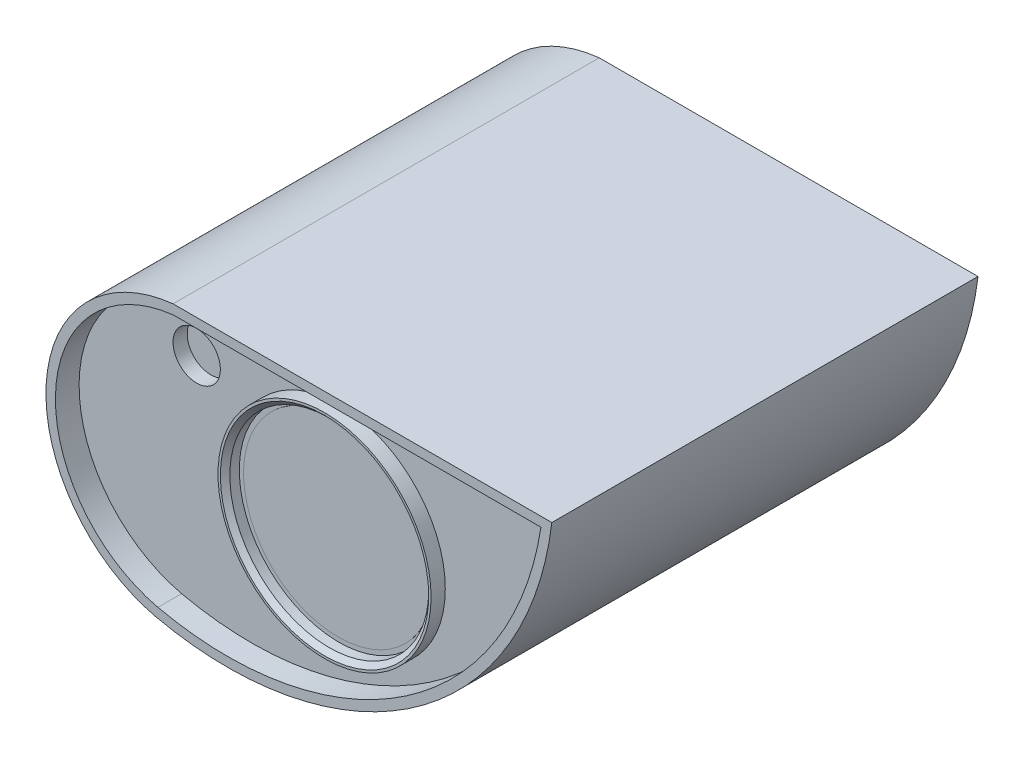
ISO-10303-21;
HEADER;
FILE_DESCRIPTION(('STEP AP214'),'2;1');
FILE_NAME('part.step','',(''),(''),'','','');
FILE_SCHEMA(('AUTOMOTIVE_DESIGN { 1 0 10303 214 1 1 1 1 }'));
ENDSEC;
DATA;
#1=APPLICATION_CONTEXT('core data for automotive mechanical design processes');
#2=APPLICATION_PROTOCOL_DEFINITION('international standard','automotive_design',2000,#1);
#3=PRODUCT_CONTEXT('',#1,'mechanical');
#4=PRODUCT('Part','Part','',(#3));
#5=PRODUCT_RELATED_PRODUCT_CATEGORY('part','',(#4));
#6=PRODUCT_DEFINITION_FORMATION('','',#4);
#7=PRODUCT_DEFINITION_CONTEXT('part definition',#1,'design');
#8=PRODUCT_DEFINITION('design','',#6,#7);
#9=PRODUCT_DEFINITION_SHAPE('','',#8);
#10=(LENGTH_UNIT() NAMED_UNIT(*) SI_UNIT(.MILLI.,.METRE.));
#11=(NAMED_UNIT(*) PLANE_ANGLE_UNIT() SI_UNIT($,.RADIAN.));
#12=(NAMED_UNIT(*) SI_UNIT($,.STERADIAN.) SOLID_ANGLE_UNIT());
#13=UNCERTAINTY_MEASURE_WITH_UNIT(LENGTH_MEASURE(1.E-05),#10,'distance_accuracy_value','');
#14=(GEOMETRIC_REPRESENTATION_CONTEXT(3) GLOBAL_UNCERTAINTY_ASSIGNED_CONTEXT((#13)) GLOBAL_UNIT_ASSIGNED_CONTEXT((#10,
#11,#12)) REPRESENTATION_CONTEXT('',''));
#15=CARTESIAN_POINT('',(0.,0.,0.));
#16=DIRECTION('',(0.,0.,1.));
#17=DIRECTION('',(1.,0.,0.));
#18=AXIS2_PLACEMENT_3D('',#15,#16,#17);
#19=CARTESIAN_POINT('',(30.,-28.3861797156921,85.1));
#20=DIRECTION('',(0.,0.,-1.));
#21=DIRECTION('',(-1.,0.,0.));
#22=AXIS2_PLACEMENT_3D('',#19,#20,#21);
#23=CYLINDRICAL_SURFACE('',#22,20.);
#24=CARTESIAN_POINT('',(30.,-28.3861797156921,85.1));
#25=DIRECTION('',(0.,0.,1.));
#26=DIRECTION('',(1.,0.,0.));
#27=AXIS2_PLACEMENT_3D('',#24,#25,#26);
#28=CIRCLE('',#27,20.);
#29=CARTESIAN_POINT('',(50.,-28.3861797156921,85.1));
#30=VERTEX_POINT('',#29);
#31=EDGE_CURVE('E11',#30,#30,#28,.T.);
#32=ORIENTED_EDGE('',*,*,#31,.F.);
#33=EDGE_LOOP('',(#32));
#34=FACE_BOUND('',#33,.T.);
#35=CARTESIAN_POINT('',(30.,-28.3861797156921,85.));
#36=DIRECTION('',(0.,0.,1.));
#37=DIRECTION('',(1.,0.,0.));
#38=AXIS2_PLACEMENT_3D('',#35,#36,#37);
#39=CIRCLE('',#38,20.);
#40=CARTESIAN_POINT('',(50.,-28.3861797156921,85.));
#41=VERTEX_POINT('',#40);
#42=EDGE_CURVE('E59',#41,#41,#39,.T.);
#43=ORIENTED_EDGE('',*,*,#42,.T.);
#44=EDGE_LOOP('',(#43));
#45=FACE_BOUND('',#44,.T.);
#46=ADVANCED_FACE('F56',(#34,#45),#23,.T.);
#47=CARTESIAN_POINT('',(30.,-28.3861797156921,85.1));
#48=DIRECTION('',(0.,0.,1.));
#49=DIRECTION('',(1.,0.,0.));
#50=AXIS2_PLACEMENT_3D('',#47,#48,#49);
#51=PLANE('',#50);
#52=ORIENTED_EDGE('',*,*,#31,.T.);
#53=EDGE_LOOP('',(#52));
#54=FACE_BOUND('',#53,.T.);
#55=ADVANCED_FACE('F71',(#54),#51,.T.);
#56=CARTESIAN_POINT('',(30.,-28.3861797156921,85.));
#57=DIRECTION('',(0.,0.,1.));
#58=DIRECTION('',(1.,0.,0.));
#59=AXIS2_PLACEMENT_3D('',#56,#57,#58);
#60=PLANE('',#59);
#61=ORIENTED_EDGE('',*,*,#42,.F.);
#62=EDGE_LOOP('',(#61));
#63=FACE_BOUND('',#62,.T.);
#64=ADVANCED_FACE('F69',(#63),#60,.F.);
#65=CLOSED_SHELL('',(#46,#55,#64));
#66=MANIFOLD_SOLID_BREP('B2',#65);
#67=CARTESIAN_POINT('',(0.,0.,85.));
#68=DIRECTION('',(0.,0.,1.));
#69=DIRECTION('',(1.,0.,0.));
#70=AXIS2_PLACEMENT_3D('',#67,#68,#69);
#71=PLANE('',#70);
#72=CARTESIAN_POINT('',(30.,-28.3861797156921,85.));
#73=DIRECTION('',(0.,0.,1.));
#74=DIRECTION('',(1.,0.,0.));
#75=AXIS2_PLACEMENT_3D('',#72,#73,#74);
#76=CIRCLE('',#75,20.);
#77=CARTESIAN_POINT('',(50.,-28.3861797156921,85.));
#78=VERTEX_POINT('',#77);
#79=EDGE_CURVE('E273',#78,#78,#76,.T.);
#80=ORIENTED_EDGE('',*,*,#79,.F.);
#81=EDGE_LOOP('',(#80));
#82=FACE_BOUND('',#81,.T.);
#83=CARTESIAN_POINT('',(30.,-28.3861797156921,85.));
#84=DIRECTION('',(0.,0.,1.));
#85=DIRECTION('',(1.,0.,0.));
#86=AXIS2_PLACEMENT_3D('',#83,#84,#85);
#87=CIRCLE('',#86,21.);
#88=CARTESIAN_POINT('',(51.,-28.3861797156921,85.));
#89=VERTEX_POINT('',#88);
#90=EDGE_CURVE('E216',#89,#89,#87,.F.);
#91=ORIENTED_EDGE('',*,*,#90,.F.);
#92=EDGE_LOOP('',(#91));
#93=FACE_BOUND('',#92,.T.);
#94=ADVANCED_FACE('F106',(#82,#93),#71,.T.);
#95=CARTESIAN_POINT('',(0.,0.,90.));
#96=DIRECTION('',(0.,0.,1.));
#97=DIRECTION('',(1.,0.,0.));
#98=AXIS2_PLACEMENT_3D('',#95,#96,#97);
#99=PLANE('',#98);
#100=CARTESIAN_POINT('',(11.4971292391756,8.26781092707103,90.));
#101=DIRECTION('',(0.,0.,1.));
#102=DIRECTION('',(1.,0.,0.));
#103=AXIS2_PLACEMENT_3D('',#100,#101,#102);
#104=CIRCLE('',#103,69.);
#105=CARTESIAN_POINT('',(80.,0.,90.));
#106=VERTEX_POINT('',#105);
#107=CARTESIAN_POINT('',(-3.63353701608754,-59.0527872481669,90.));
#108=VERTEX_POINT('',#107);
#109=EDGE_CURVE('E199',#106,#108,#104,.F.);
#110=ORIENTED_EDGE('',*,*,#109,.F.);
#111=DIRECTION('',(1.,0.,0.));
#112=VECTOR('',#111,1.);
#113=CARTESIAN_POINT('',(0.,0.,90.));
#114=LINE('',#113,#112);
#115=CARTESIAN_POINT('',(0.0131808239209842,0.,90.));
#116=VERTEX_POINT('',#115);
#117=EDGE_CURVE('E201',#116,#106,#114,.T.);
#118=ORIENTED_EDGE('',*,*,#117,.F.);
#119=CARTESIAN_POINT('',(3.16706713926035,-29.8337560677484,90.));
#120=DIRECTION('',(0.,0.,1.));
#121=DIRECTION('',(1.,0.,0.));
#122=AXIS2_PLACEMENT_3D('',#119,#120,#121);
#123=CIRCLE('',#122,30.);
#124=EDGE_CURVE('E131',#116,#108,#123,.T.);
#125=ORIENTED_EDGE('',*,*,#124,.T.);
#126=EDGE_LOOP('',(#110,#118,#125));
#127=FACE_BOUND('',#126,.T.);
#128=DIRECTION('',(1.,0.,0.));
#129=VECTOR('',#128,1.);
#130=CARTESIAN_POINT('',(0.,-2.,90.));
#131=LINE('',#130,#129);
#132=CARTESIAN_POINT('',(0.1204258474311,-2.,90.));
#133=VERTEX_POINT('',#132);
#134=CARTESIAN_POINT('',(77.7056789798694,-2.,90.));
#135=VERTEX_POINT('',#134);
#136=EDGE_CURVE('E122',#133,#135,#131,.T.);
#137=ORIENTED_EDGE('',*,*,#136,.T.);
#138=CARTESIAN_POINT('',(11.4971292391756,8.26781092707103,90.));
#139=DIRECTION('',(0.,0.,1.));
#140=DIRECTION('',(1.,0.,0.));
#141=AXIS2_PLACEMENT_3D('',#138,#139,#140);
#142=CIRCLE('',#141,67.);
#143=CARTESIAN_POINT('',(-3.18748536572449,-57.1031466451227,90.));
#144=VERTEX_POINT('',#143);
#145=EDGE_CURVE('E174',#135,#144,#142,.F.);
#146=ORIENTED_EDGE('',*,*,#145,.T.);
#147=CARTESIAN_POINT('',(3.16706713926035,-29.8337560677484,90.));
#148=DIRECTION('',(0.,0.,1.));
#149=DIRECTION('',(1.,0.,0.));
#150=AXIS2_PLACEMENT_3D('',#147,#148,#149);
#151=CIRCLE('',#150,28.);
#152=EDGE_CURVE('E197',#133,#144,#151,.T.);
#153=ORIENTED_EDGE('',*,*,#152,.F.);
#154=EDGE_LOOP('',(#137,#146,#153));
#155=FACE_BOUND('',#154,.T.);
#156=ADVANCED_FACE('F238',(#127,#155),#99,.T.);
#157=CARTESIAN_POINT('',(11.4971292391756,8.26781092707103,90.));
#158=DIRECTION('',(0.,0.,-1.));
#159=DIRECTION('',(-1.,0.,0.));
#160=AXIS2_PLACEMENT_3D('',#157,#158,#159);
#161=CYLINDRICAL_SURFACE('',#160,69.);
#162=CARTESIAN_POINT('',(11.4971292391756,8.26781092707103,0.));
#163=DIRECTION('',(0.,0.,1.));
#164=DIRECTION('',(1.,0.,0.));
#165=AXIS2_PLACEMENT_3D('',#162,#163,#164);
#166=CIRCLE('',#165,69.);
#167=CARTESIAN_POINT('',(80.,0.,0.));
#168=VERTEX_POINT('',#167);
#169=CARTESIAN_POINT('',(-3.63353701608754,-59.0527872481669,0.));
#170=VERTEX_POINT('',#169);
#171=EDGE_CURVE('E176',#168,#170,#166,.F.);
#172=ORIENTED_EDGE('',*,*,#171,.F.);
#173=DIRECTION('',(0.,0.,-1.));
#174=VECTOR('',#173,1.);
#175=CARTESIAN_POINT('',(80.,0.,90.));
#176=LINE('',#175,#174);
#177=EDGE_CURVE('E152',#106,#168,#176,.T.);
#178=ORIENTED_EDGE('',*,*,#177,.F.);
#179=ORIENTED_EDGE('',*,*,#109,.T.);
#180=DIRECTION('',(0.,0.,-1.));
#181=VECTOR('',#180,1.);
#182=CARTESIAN_POINT('',(-3.63353701608754,-59.0527872481669,90.));
#183=LINE('',#182,#181);
#184=EDGE_CURVE('E149',#108,#170,#183,.T.);
#185=ORIENTED_EDGE('',*,*,#184,.T.);
#186=EDGE_LOOP('',(#172,#178,#179,#185));
#187=FACE_BOUND('',#186,.T.);
#188=ADVANCED_FACE('F244',(#187),#161,.T.);
#189=CARTESIAN_POINT('',(0.,0.,90.));
#190=DIRECTION('',(0.,1.,0.));
#191=DIRECTION('',(0.,0.,1.));
#192=AXIS2_PLACEMENT_3D('',#189,#190,#191);
#193=PLANE('',#192);
#194=DIRECTION('',(1.,0.,0.));
#195=VECTOR('',#194,1.);
#196=CARTESIAN_POINT('',(0.,0.,0.));
#197=LINE('',#196,#195);
#198=CARTESIAN_POINT('',(0.0131808239209842,0.,0.));
#199=VERTEX_POINT('',#198);
#200=EDGE_CURVE('E208',#199,#168,#197,.T.);
#201=ORIENTED_EDGE('',*,*,#200,.F.);
#202=DIRECTION('',(0.,0.,-1.));
#203=VECTOR('',#202,1.);
#204=CARTESIAN_POINT('',(0.0131808239209842,0.,90.));
#205=LINE('',#204,#203);
#206=EDGE_CURVE('E213',#116,#199,#205,.T.);
#207=ORIENTED_EDGE('',*,*,#206,.F.);
#208=ORIENTED_EDGE('',*,*,#117,.T.);
#209=ORIENTED_EDGE('',*,*,#177,.T.);
#210=EDGE_LOOP('',(#201,#207,#208,#209));
#211=FACE_BOUND('',#210,.T.);
#212=ADVANCED_FACE('F293',(#211),#193,.T.);
#213=CARTESIAN_POINT('',(3.16706713926035,-29.8337560677484,90.));
#214=DIRECTION('',(0.,0.,-1.));
#215=DIRECTION('',(-1.,0.,0.));
#216=AXIS2_PLACEMENT_3D('',#213,#214,#215);
#217=CYLINDRICAL_SURFACE('',#216,30.);
#218=CARTESIAN_POINT('',(3.16706713926035,-29.8337560677484,0.));
#219=DIRECTION('',(0.,0.,1.));
#220=DIRECTION('',(1.,0.,0.));
#221=AXIS2_PLACEMENT_3D('',#218,#219,#220);
#222=CIRCLE('',#221,30.);
#223=EDGE_CURVE('E202',#199,#170,#222,.T.);
#224=ORIENTED_EDGE('',*,*,#223,.T.);
#225=ORIENTED_EDGE('',*,*,#184,.F.);
#226=ORIENTED_EDGE('',*,*,#124,.F.);
#227=ORIENTED_EDGE('',*,*,#206,.T.);
#228=EDGE_LOOP('',(#224,#225,#226,#227));
#229=FACE_BOUND('',#228,.T.);
#230=ADVANCED_FACE('F288',(#229),#217,.T.);
#231=CARTESIAN_POINT('',(0.,0.,0.));
#232=DIRECTION('',(0.,0.,1.));
#233=DIRECTION('',(1.,0.,0.));
#234=AXIS2_PLACEMENT_3D('',#231,#232,#233);
#235=PLANE('',#234);
#236=CARTESIAN_POINT('',(30.,-28.3861797156921,0.));
#237=DIRECTION('',(0.,0.,1.));
#238=DIRECTION('',(1.,0.,0.));
#239=AXIS2_PLACEMENT_3D('',#236,#237,#238);
#240=CIRCLE('',#239,20.);
#241=CARTESIAN_POINT('',(50.,-28.3861797156921,0.));
#242=VERTEX_POINT('',#241);
#243=EDGE_CURVE('E186',#242,#242,#240,.T.);
#244=ORIENTED_EDGE('',*,*,#243,.T.);
#245=EDGE_LOOP('',(#244));
#246=FACE_BOUND('',#245,.T.);
#247=ORIENTED_EDGE('',*,*,#171,.T.);
#248=ORIENTED_EDGE('',*,*,#223,.F.);
#249=ORIENTED_EDGE('',*,*,#200,.T.);
#250=EDGE_LOOP('',(#247,#248,#249));
#251=FACE_BOUND('',#250,.T.);
#252=ADVANCED_FACE('F285',(#246,#251),#235,.F.);
#253=CARTESIAN_POINT('',(11.4971292391756,8.26781092707103,90.));
#254=DIRECTION('',(0.,0.,-1.));
#255=DIRECTION('',(-1.,0.,0.));
#256=AXIS2_PLACEMENT_3D('',#253,#254,#255);
#257=CYLINDRICAL_SURFACE('',#256,67.);
#258=CARTESIAN_POINT('',(11.4971292391756,8.26781092707103,85.));
#259=DIRECTION('',(0.,0.,1.));
#260=DIRECTION('',(1.,0.,0.));
#261=AXIS2_PLACEMENT_3D('',#258,#259,#260);
#262=CIRCLE('',#261,67.);
#263=CARTESIAN_POINT('',(77.7056789798694,-2.,85.));
#264=VERTEX_POINT('',#263);
#265=CARTESIAN_POINT('',(-3.18748536572722,-57.1031466451221,85.));
#266=VERTEX_POINT('',#265);
#267=EDGE_CURVE('E172',#264,#266,#262,.F.);
#268=ORIENTED_EDGE('',*,*,#267,.T.);
#269=DIRECTION('',(0.,0.,-1.));
#270=VECTOR('',#269,1.);
#271=CARTESIAN_POINT('',(-3.18748536572449,-57.1031466451227,90.));
#272=LINE('',#271,#270);
#273=EDGE_CURVE('E193',#144,#266,#272,.T.);
#274=ORIENTED_EDGE('',*,*,#273,.F.);
#275=ORIENTED_EDGE('',*,*,#145,.F.);
#276=DIRECTION('',(0.,0.,-1.));
#277=VECTOR('',#276,1.);
#278=CARTESIAN_POINT('',(77.7056789798694,-2.,90.));
#279=LINE('',#278,#277);
#280=EDGE_CURVE('E168',#135,#264,#279,.T.);
#281=ORIENTED_EDGE('',*,*,#280,.T.);
#282=EDGE_LOOP('',(#268,#274,#275,#281));
#283=FACE_BOUND('',#282,.T.);
#284=ADVANCED_FACE('F170',(#283),#257,.F.);
#285=CARTESIAN_POINT('',(0.,-2.,90.));
#286=DIRECTION('',(0.,1.,0.));
#287=DIRECTION('',(0.,0.,1.));
#288=AXIS2_PLACEMENT_3D('',#285,#286,#287);
#289=PLANE('',#288);
#290=DIRECTION('',(1.,0.,0.));
#291=VECTOR('',#290,1.);
#292=CARTESIAN_POINT('',(0.,-2.,85.));
#293=LINE('',#292,#291);
#294=CARTESIAN_POINT('',(0.120425847431086,-2.,85.));
#295=VERTEX_POINT('',#294);
#296=EDGE_CURVE('E183',#295,#264,#293,.T.);
#297=ORIENTED_EDGE('',*,*,#296,.T.);
#298=ORIENTED_EDGE('',*,*,#280,.F.);
#299=ORIENTED_EDGE('',*,*,#136,.F.);
#300=DIRECTION('',(0.,0.,-1.));
#301=VECTOR('',#300,1.);
#302=CARTESIAN_POINT('',(0.1204258474311,-2.,90.));
#303=LINE('',#302,#301);
#304=EDGE_CURVE('E177',#133,#295,#303,.T.);
#305=ORIENTED_EDGE('',*,*,#304,.T.);
#306=EDGE_LOOP('',(#297,#298,#299,#305));
#307=FACE_BOUND('',#306,.T.);
#308=ADVANCED_FACE('F188',(#307),#289,.F.);
#309=CARTESIAN_POINT('',(3.16706713926035,-29.8337560677484,90.));
#310=DIRECTION('',(0.,0.,-1.));
#311=DIRECTION('',(-1.,0.,0.));
#312=AXIS2_PLACEMENT_3D('',#309,#310,#311);
#313=CYLINDRICAL_SURFACE('',#312,28.);
#314=CARTESIAN_POINT('',(3.16706713926035,-29.8337560677484,85.));
#315=DIRECTION('',(0.,0.,1.));
#316=DIRECTION('',(1.,0.,0.));
#317=AXIS2_PLACEMENT_3D('',#314,#315,#316);
#318=CIRCLE('',#317,28.);
#319=EDGE_CURVE('E185',#295,#266,#318,.T.);
#320=ORIENTED_EDGE('',*,*,#319,.F.);
#321=ORIENTED_EDGE('',*,*,#304,.F.);
#322=ORIENTED_EDGE('',*,*,#152,.T.);
#323=ORIENTED_EDGE('',*,*,#273,.T.);
#324=EDGE_LOOP('',(#320,#321,#322,#323));
#325=FACE_BOUND('',#324,.T.);
#326=ADVANCED_FACE('F251',(#325),#313,.F.);
#327=CARTESIAN_POINT('',(0.,-12.,85.));
#328=DIRECTION('',(0.,0.,1.));
#329=DIRECTION('',(1.,0.,0.));
#330=AXIS2_PLACEMENT_3D('',#327,#328,#329);
#331=CIRCLE('',#330,5.);
#332=CARTESIAN_POINT('',(5.,-12.,85.));
#333=VERTEX_POINT('',#332);
#334=EDGE_CURVE('E264',#333,#333,#331,.T.);
#335=ORIENTED_EDGE('',*,*,#334,.F.);
#336=EDGE_LOOP('',(#335));
#337=FACE_BOUND('',#336,.T.);
#338=CARTESIAN_POINT('',(30.,-28.3861797156921,85.));
#339=DIRECTION('',(0.,0.,1.));
#340=DIRECTION('',(1.,0.,0.));
#341=AXIS2_PLACEMENT_3D('',#338,#339,#340);
#342=CIRCLE('',#341,22.5);
#343=CARTESIAN_POINT('',(52.5,-28.3861797156921,85.));
#344=VERTEX_POINT('',#343);
#345=EDGE_CURVE('E267',#344,#344,#342,.T.);
#346=ORIENTED_EDGE('',*,*,#345,.F.);
#347=EDGE_LOOP('',(#346));
#348=FACE_BOUND('',#347,.T.);
#349=ORIENTED_EDGE('',*,*,#267,.F.);
#350=ORIENTED_EDGE('',*,*,#296,.F.);
#351=ORIENTED_EDGE('',*,*,#319,.T.);
#352=EDGE_LOOP('',(#349,#350,#351));
#353=FACE_BOUND('',#352,.T.);
#354=ADVANCED_FACE('F182',(#337,#348,#353),#71,.T.);
#355=CARTESIAN_POINT('',(30.,-28.3861797156921,0.));
#356=DIRECTION('',(0.,0.,1.));
#357=DIRECTION('',(1.,0.,0.));
#358=AXIS2_PLACEMENT_3D('',#355,#356,#357);
#359=CYLINDRICAL_SURFACE('',#358,20.);
#360=ORIENTED_EDGE('',*,*,#243,.F.);
#361=EDGE_LOOP('',(#360));
#362=FACE_BOUND('',#361,.T.);
#363=ORIENTED_EDGE('',*,*,#79,.T.);
#364=EDGE_LOOP('',(#363));
#365=FACE_BOUND('',#364,.T.);
#366=ADVANCED_FACE('F250',(#362,#365),#359,.F.);
#367=CARTESIAN_POINT('',(30.,-28.3861797156921,88.));
#368=DIRECTION('',(0.,0.,1.));
#369=DIRECTION('',(1.,0.,0.));
#370=AXIS2_PLACEMENT_3D('',#367,#368,#369);
#371=PLANE('',#370);
#372=CARTESIAN_POINT('',(30.,-28.3861797156921,88.));
#373=DIRECTION('',(0.,0.,1.));
#374=DIRECTION('',(1.,0.,0.));
#375=AXIS2_PLACEMENT_3D('',#372,#373,#374);
#376=CIRCLE('',#375,22.);
#377=CARTESIAN_POINT('',(52.,-28.3861797156921,88.));
#378=VERTEX_POINT('',#377);
#379=EDGE_CURVE('E54',#378,#378,#376,.F.);
#380=ORIENTED_EDGE('',*,*,#379,.T.);
#381=EDGE_LOOP('',(#380));
#382=FACE_BOUND('',#381,.T.);
#383=CARTESIAN_POINT('',(30.,-28.3861797156921,88.));
#384=DIRECTION('',(0.,0.,1.));
#385=DIRECTION('',(1.,0.,0.));
#386=AXIS2_PLACEMENT_3D('',#383,#384,#385);
#387=CIRCLE('',#386,22.5);
#388=CARTESIAN_POINT('',(52.5,-28.3861797156921,88.));
#389=VERTEX_POINT('',#388);
#390=EDGE_CURVE('E269',#389,#389,#387,.T.);
#391=ORIENTED_EDGE('',*,*,#390,.T.);
#392=EDGE_LOOP('',(#391));
#393=FACE_BOUND('',#392,.T.);
#394=ADVANCED_FACE('F257',(#382,#393),#371,.T.);
#395=CARTESIAN_POINT('',(30.,-28.3861797156921,88.));
#396=DIRECTION('',(0.,0.,-1.));
#397=DIRECTION('',(-1.,0.,0.));
#398=AXIS2_PLACEMENT_3D('',#395,#396,#397);
#399=CYLINDRICAL_SURFACE('',#398,22.5);
#400=ORIENTED_EDGE('',*,*,#390,.F.);
#401=EDGE_LOOP('',(#400));
#402=FACE_BOUND('',#401,.T.);
#403=ORIENTED_EDGE('',*,*,#345,.T.);
#404=EDGE_LOOP('',(#403));
#405=FACE_BOUND('',#404,.T.);
#406=ADVANCED_FACE('F234',(#402,#405),#399,.T.);
#407=CARTESIAN_POINT('',(30.,-28.3861797156921,88.));
#408=DIRECTION('',(0.,0.,-1.));
#409=DIRECTION('',(-1.,0.,0.));
#410=AXIS2_PLACEMENT_3D('',#407,#408,#409);
#411=CYLINDRICAL_SURFACE('',#410,21.);
#412=CARTESIAN_POINT('',(30.,-28.3861797156921,87.));
#413=DIRECTION('',(0.,0.,1.));
#414=DIRECTION('',(1.,0.,0.));
#415=AXIS2_PLACEMENT_3D('',#412,#413,#414);
#416=CIRCLE('',#415,21.);
#417=CARTESIAN_POINT('',(51.,-28.3861797156921,87.));
#418=VERTEX_POINT('',#417);
#419=EDGE_CURVE('E115',#418,#418,#416,.T.);
#420=ORIENTED_EDGE('',*,*,#419,.T.);
#421=EDGE_LOOP('',(#420));
#422=FACE_BOUND('',#421,.T.);
#423=ORIENTED_EDGE('',*,*,#90,.T.);
#424=EDGE_LOOP('',(#423));
#425=FACE_BOUND('',#424,.T.);
#426=ADVANCED_FACE('F221',(#422,#425),#411,.F.);
#427=CARTESIAN_POINT('',(30.,-28.3861797156921,87.));
#428=DIRECTION('',(0.,0.,1.));
#429=DIRECTION('',(1.,0.,0.));
#430=AXIS2_PLACEMENT_3D('',#427,#428,#429);
#431=CONICAL_SURFACE('',#430,21.,0.785398163397452);
#432=ORIENTED_EDGE('',*,*,#379,.F.);
#433=EDGE_LOOP('',(#432));
#434=FACE_BOUND('',#433,.T.);
#435=ORIENTED_EDGE('',*,*,#419,.F.);
#436=EDGE_LOOP('',(#435));
#437=FACE_BOUND('',#436,.T.);
#438=ADVANCED_FACE('F109',(#434,#437),#431,.F.);
#439=CARTESIAN_POINT('',(0.,-12.,82.));
#440=DIRECTION('',(0.,0.,1.));
#441=DIRECTION('',(1.,0.,0.));
#442=AXIS2_PLACEMENT_3D('',#439,#440,#441);
#443=CYLINDRICAL_SURFACE('',#442,5.);
#444=CARTESIAN_POINT('',(0.,-12.,82.));
#445=DIRECTION('',(0.,0.,1.));
#446=DIRECTION('',(1.,0.,0.));
#447=AXIS2_PLACEMENT_3D('',#444,#445,#446);
#448=CIRCLE('',#447,5.);
#449=CARTESIAN_POINT('',(5.,-12.,82.));
#450=VERTEX_POINT('',#449);
#451=EDGE_CURVE('E270',#450,#450,#448,.T.);
#452=ORIENTED_EDGE('',*,*,#451,.F.);
#453=EDGE_LOOP('',(#452));
#454=FACE_BOUND('',#453,.T.);
#455=ORIENTED_EDGE('',*,*,#334,.T.);
#456=EDGE_LOOP('',(#455));
#457=FACE_BOUND('',#456,.T.);
#458=ADVANCED_FACE('F225',(#454,#457),#443,.F.);
#459=CARTESIAN_POINT('',(0.,-12.,82.));
#460=DIRECTION('',(0.,0.,1.));
#461=DIRECTION('',(1.,0.,0.));
#462=AXIS2_PLACEMENT_3D('',#459,#460,#461);
#463=PLANE('',#462);
#464=ORIENTED_EDGE('',*,*,#451,.T.);
#465=EDGE_LOOP('',(#464));
#466=FACE_BOUND('',#465,.T.);
#467=ADVANCED_FACE('F231',(#466),#463,.T.);
#468=CLOSED_SHELL('',(#94,#156,#188,#212,#230,#252,#284,#308,#326,#354,#366,#394,#406,#426,#438,
#458,#467));
#469=MANIFOLD_SOLID_BREP('B6',#468);
#470=ADVANCED_BREP_SHAPE_REPRESENTATION('',(#18,#66,#469),#14);
#471=SHAPE_DEFINITION_REPRESENTATION(#9,#470);
ENDSEC;
END-ISO-10303-21;
